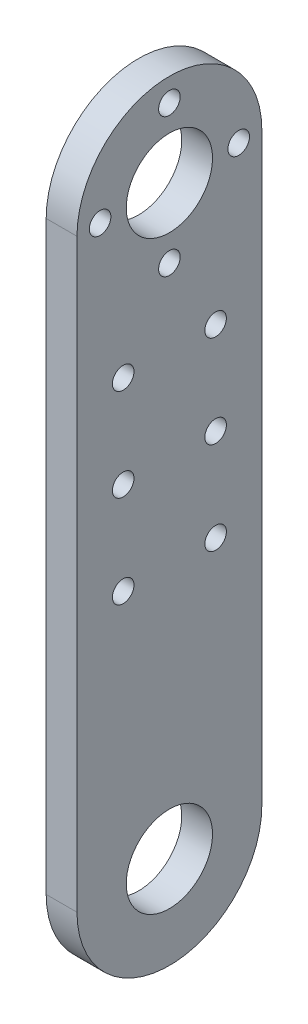
ISO-10303-21;
HEADER;
FILE_DESCRIPTION(('STEP AP214'),'2;1');
FILE_NAME('part.step','',(''),(''),'','','');
FILE_SCHEMA(('AUTOMOTIVE_DESIGN { 1 0 10303 214 1 1 1 1 }'));
ENDSEC;
DATA;
#1=APPLICATION_CONTEXT('core data for automotive mechanical design processes');
#2=APPLICATION_PROTOCOL_DEFINITION('international standard','automotive_design',2000,#1);
#3=PRODUCT_CONTEXT('',#1,'mechanical');
#4=PRODUCT('Part','Part','',(#3));
#5=PRODUCT_RELATED_PRODUCT_CATEGORY('part','',(#4));
#6=PRODUCT_DEFINITION_FORMATION('','',#4);
#7=PRODUCT_DEFINITION_CONTEXT('part definition',#1,'design');
#8=PRODUCT_DEFINITION('design','',#6,#7);
#9=PRODUCT_DEFINITION_SHAPE('','',#8);
#10=(LENGTH_UNIT() NAMED_UNIT(*) SI_UNIT(.MILLI.,.METRE.));
#11=(NAMED_UNIT(*) PLANE_ANGLE_UNIT() SI_UNIT($,.RADIAN.));
#12=(NAMED_UNIT(*) SI_UNIT($,.STERADIAN.) SOLID_ANGLE_UNIT());
#13=UNCERTAINTY_MEASURE_WITH_UNIT(LENGTH_MEASURE(1.E-05),#10,'distance_accuracy_value','');
#14=(GEOMETRIC_REPRESENTATION_CONTEXT(3) GLOBAL_UNCERTAINTY_ASSIGNED_CONTEXT((#13)) GLOBAL_UNIT_ASSIGNED_CONTEXT((#10,
#11,#12)) REPRESENTATION_CONTEXT('',''));
#15=CARTESIAN_POINT('',(0.,0.,0.));
#16=DIRECTION('',(0.,0.,1.));
#17=DIRECTION('',(1.,0.,0.));
#18=AXIS2_PLACEMENT_3D('',#15,#16,#17);
#19=CARTESIAN_POINT('',(-20.,500.,120.));
#20=DIRECTION('',(1.,0.,0.));
#21=DIRECTION('',(0.,1.,0.));
#22=AXIS2_PLACEMENT_3D('',#19,#20,#21);
#23=PLANE('',#22);
#24=CARTESIAN_POINT('',(-20.,485.,60.));
#25=DIRECTION('',(1.,0.,0.));
#26=DIRECTION('',(0.,1.,0.));
#27=AXIS2_PLACEMENT_3D('',#24,#25,#26);
#28=CIRCLE('',#27,7.00000000000001);
#29=CARTESIAN_POINT('',(-20.,492.,60.));
#30=VERTEX_POINT('',#29);
#31=EDGE_CURVE('E179',#30,#30,#28,.T.);
#32=ORIENTED_EDGE('',*,*,#31,.T.);
#33=EDGE_LOOP('',(#32));
#34=FACE_BOUND('',#33,.T.);
#35=CARTESIAN_POINT('',(-20.,440.,105.));
#36=DIRECTION('',(1.,0.,0.));
#37=DIRECTION('',(0.,1.,0.));
#38=AXIS2_PLACEMENT_3D('',#35,#36,#37);
#39=CIRCLE('',#38,7.00000000000001);
#40=CARTESIAN_POINT('',(-20.,447.,105.));
#41=VERTEX_POINT('',#40);
#42=EDGE_CURVE('E173',#41,#41,#39,.T.);
#43=ORIENTED_EDGE('',*,*,#42,.T.);
#44=EDGE_LOOP('',(#43));
#45=FACE_BOUND('',#44,.T.);
#46=CARTESIAN_POINT('',(-20.,395.,60.));
#47=DIRECTION('',(1.,0.,0.));
#48=DIRECTION('',(0.,1.,0.));
#49=AXIS2_PLACEMENT_3D('',#46,#47,#48);
#50=CIRCLE('',#49,7.00000000000001);
#51=CARTESIAN_POINT('',(-20.,402.,60.));
#52=VERTEX_POINT('',#51);
#53=EDGE_CURVE('E167',#52,#52,#50,.T.);
#54=ORIENTED_EDGE('',*,*,#53,.T.);
#55=EDGE_LOOP('',(#54));
#56=FACE_BOUND('',#55,.T.);
#57=CARTESIAN_POINT('',(-20.,440.,15.));
#58=DIRECTION('',(1.,0.,0.));
#59=DIRECTION('',(0.,1.,0.));
#60=AXIS2_PLACEMENT_3D('',#57,#58,#59);
#61=CIRCLE('',#60,7.00000000000001);
#62=CARTESIAN_POINT('',(-20.,447.,15.));
#63=VERTEX_POINT('',#62);
#64=EDGE_CURVE('E161',#63,#63,#61,.T.);
#65=ORIENTED_EDGE('',*,*,#64,.T.);
#66=EDGE_LOOP('',(#65));
#67=FACE_BOUND('',#66,.T.);
#68=CARTESIAN_POINT('',(-20.,225.486069721099,90.));
#69=DIRECTION('',(1.,0.,0.));
#70=DIRECTION('',(0.,1.,0.));
#71=AXIS2_PLACEMENT_3D('',#68,#69,#70);
#72=CIRCLE('',#71,6.99999999999999);
#73=CARTESIAN_POINT('',(-20.,232.486069721099,90.));
#74=VERTEX_POINT('',#73);
#75=EDGE_CURVE('E155',#74,#74,#72,.T.);
#76=ORIENTED_EDGE('',*,*,#75,.T.);
#77=EDGE_LOOP('',(#76));
#78=FACE_BOUND('',#77,.T.);
#79=CARTESIAN_POINT('',(-20.,285.486069721099,90.));
#80=DIRECTION('',(1.,0.,0.));
#81=DIRECTION('',(0.,1.,0.));
#82=AXIS2_PLACEMENT_3D('',#79,#80,#81);
#83=CIRCLE('',#82,7.00000000000001);
#84=CARTESIAN_POINT('',(-20.,292.486069721099,90.));
#85=VERTEX_POINT('',#84);
#86=EDGE_CURVE('E149',#85,#85,#83,.T.);
#87=ORIENTED_EDGE('',*,*,#86,.T.);
#88=EDGE_LOOP('',(#87));
#89=FACE_BOUND('',#88,.T.);
#90=CARTESIAN_POINT('',(-20.,285.486069721099,30.));
#91=DIRECTION('',(1.,0.,0.));
#92=DIRECTION('',(0.,1.,0.));
#93=AXIS2_PLACEMENT_3D('',#90,#91,#92);
#94=CIRCLE('',#93,7.00000000000001);
#95=CARTESIAN_POINT('',(-20.,292.486069721099,30.));
#96=VERTEX_POINT('',#95);
#97=EDGE_CURVE('E143',#96,#96,#94,.T.);
#98=ORIENTED_EDGE('',*,*,#97,.T.);
#99=EDGE_LOOP('',(#98));
#100=FACE_BOUND('',#99,.T.);
#101=CARTESIAN_POINT('',(-20.,225.486069721099,30.));
#102=DIRECTION('',(1.,0.,0.));
#103=DIRECTION('',(0.,1.,0.));
#104=AXIS2_PLACEMENT_3D('',#101,#102,#103);
#105=CIRCLE('',#104,6.99999999999999);
#106=CARTESIAN_POINT('',(-20.,232.486069721099,30.));
#107=VERTEX_POINT('',#106);
#108=EDGE_CURVE('E137',#107,#107,#105,.T.);
#109=ORIENTED_EDGE('',*,*,#108,.T.);
#110=EDGE_LOOP('',(#109));
#111=FACE_BOUND('',#110,.T.);
#112=CARTESIAN_POINT('',(-20.,345.486069721099,30.));
#113=DIRECTION('',(1.,0.,0.));
#114=DIRECTION('',(0.,1.,0.));
#115=AXIS2_PLACEMENT_3D('',#112,#113,#114);
#116=CIRCLE('',#115,7.00000000000001);
#117=CARTESIAN_POINT('',(-20.,352.486069721099,30.));
#118=VERTEX_POINT('',#117);
#119=EDGE_CURVE('E131',#118,#118,#116,.T.);
#120=ORIENTED_EDGE('',*,*,#119,.T.);
#121=EDGE_LOOP('',(#120));
#122=FACE_BOUND('',#121,.T.);
#123=CARTESIAN_POINT('',(-20.,345.486069721099,90.));
#124=DIRECTION('',(1.,0.,0.));
#125=DIRECTION('',(0.,1.,0.));
#126=AXIS2_PLACEMENT_3D('',#123,#124,#125);
#127=CIRCLE('',#126,7.00000000000001);
#128=CARTESIAN_POINT('',(-20.,352.486069721099,90.));
#129=VERTEX_POINT('',#128);
#130=EDGE_CURVE('E95',#129,#129,#127,.T.);
#131=ORIENTED_EDGE('',*,*,#130,.T.);
#132=EDGE_LOOP('',(#131));
#133=FACE_BOUND('',#132,.T.);
#134=CARTESIAN_POINT('',(-20.,440.,60.));
#135=DIRECTION('',(1.,0.,0.));
#136=DIRECTION('',(0.,1.,0.));
#137=AXIS2_PLACEMENT_3D('',#134,#135,#136);
#138=CIRCLE('',#137,28.);
#139=CARTESIAN_POINT('',(-20.,468.,60.));
#140=VERTEX_POINT('',#139);
#141=EDGE_CURVE('E110',#140,#140,#138,.T.);
#142=ORIENTED_EDGE('',*,*,#141,.T.);
#143=EDGE_LOOP('',(#142));
#144=FACE_BOUND('',#143,.T.);
#145=CARTESIAN_POINT('',(-20.,60.,60.));
#146=DIRECTION('',(1.,0.,0.));
#147=DIRECTION('',(0.,1.,0.));
#148=AXIS2_PLACEMENT_3D('',#145,#146,#147);
#149=CIRCLE('',#148,28.);
#150=CARTESIAN_POINT('',(-20.,88.,60.));
#151=VERTEX_POINT('',#150);
#152=EDGE_CURVE('E105',#151,#151,#149,.T.);
#153=ORIENTED_EDGE('',*,*,#152,.T.);
#154=EDGE_LOOP('',(#153));
#155=FACE_BOUND('',#154,.T.);
#156=DIRECTION('',(0.,-1.,0.));
#157=VECTOR('',#156,1.);
#158=CARTESIAN_POINT('',(-20.,500.,120.));
#159=LINE('',#158,#157);
#160=CARTESIAN_POINT('',(-20.,440.,120.));
#161=VERTEX_POINT('',#160);
#162=CARTESIAN_POINT('',(-20.,60.0000000000001,120.));
#163=VERTEX_POINT('',#162);
#164=EDGE_CURVE('E50',#161,#163,#159,.T.);
#165=ORIENTED_EDGE('',*,*,#164,.F.);
#166=CARTESIAN_POINT('',(-20.,440.,60.));
#167=DIRECTION('',(-1.,0.,0.));
#168=DIRECTION('',(0.,-1.,0.));
#169=AXIS2_PLACEMENT_3D('',#166,#167,#168);
#170=CIRCLE('',#169,60.);
#171=CARTESIAN_POINT('',(-20.,440.,0.));
#172=VERTEX_POINT('',#171);
#173=EDGE_CURVE('E80',#161,#172,#170,.T.);
#174=ORIENTED_EDGE('',*,*,#173,.T.);
#175=DIRECTION('',(0.,-1.,0.));
#176=VECTOR('',#175,1.);
#177=CARTESIAN_POINT('',(-20.,500.,0.));
#178=LINE('',#177,#176);
#179=CARTESIAN_POINT('',(-20.,60.0000000000001,0.));
#180=VERTEX_POINT('',#179);
#181=EDGE_CURVE('E101',#172,#180,#178,.T.);
#182=ORIENTED_EDGE('',*,*,#181,.T.);
#183=CARTESIAN_POINT('',(-20.,60.0000000000001,60.));
#184=DIRECTION('',(-1.,0.,0.));
#185=DIRECTION('',(0.,-1.,0.));
#186=AXIS2_PLACEMENT_3D('',#183,#184,#185);
#187=CIRCLE('',#186,60.);
#188=EDGE_CURVE('E98',#180,#163,#187,.T.);
#189=ORIENTED_EDGE('',*,*,#188,.T.);
#190=EDGE_LOOP('',(#165,#174,#182,#189));
#191=FACE_BOUND('',#190,.T.);
#192=ADVANCED_FACE('F42',(#34,#45,#56,#67,#78,#89,#100,#111,#122,#133,#144,#155,#191),#23,.F.);
#193=CARTESIAN_POINT('',(0.,500.,120.));
#194=DIRECTION('',(1.,0.,0.));
#195=DIRECTION('',(0.,1.,0.));
#196=AXIS2_PLACEMENT_3D('',#193,#194,#195);
#197=PLANE('',#196);
#198=CARTESIAN_POINT('',(0.,485.,60.));
#199=DIRECTION('',(1.,0.,0.));
#200=DIRECTION('',(0.,0.,-1.));
#201=AXIS2_PLACEMENT_3D('',#198,#199,#200);
#202=CIRCLE('',#201,7.00000000000001);
#203=CARTESIAN_POINT('',(0.,485.,53.));
#204=VERTEX_POINT('',#203);
#205=EDGE_CURVE('E182',#204,#204,#202,.T.);
#206=ORIENTED_EDGE('',*,*,#205,.F.);
#207=EDGE_LOOP('',(#206));
#208=FACE_BOUND('',#207,.T.);
#209=CARTESIAN_POINT('',(0.,440.,105.));
#210=DIRECTION('',(1.,0.,0.));
#211=DIRECTION('',(0.,0.,-1.));
#212=AXIS2_PLACEMENT_3D('',#209,#210,#211);
#213=CIRCLE('',#212,7.00000000000001);
#214=CARTESIAN_POINT('',(0.,440.,98.));
#215=VERTEX_POINT('',#214);
#216=EDGE_CURVE('E176',#215,#215,#213,.T.);
#217=ORIENTED_EDGE('',*,*,#216,.F.);
#218=EDGE_LOOP('',(#217));
#219=FACE_BOUND('',#218,.T.);
#220=CARTESIAN_POINT('',(0.,395.,60.));
#221=DIRECTION('',(1.,0.,0.));
#222=DIRECTION('',(0.,0.,-1.));
#223=AXIS2_PLACEMENT_3D('',#220,#221,#222);
#224=CIRCLE('',#223,7.00000000000001);
#225=CARTESIAN_POINT('',(0.,395.,53.));
#226=VERTEX_POINT('',#225);
#227=EDGE_CURVE('E170',#226,#226,#224,.T.);
#228=ORIENTED_EDGE('',*,*,#227,.F.);
#229=EDGE_LOOP('',(#228));
#230=FACE_BOUND('',#229,.T.);
#231=CARTESIAN_POINT('',(0.,440.,15.));
#232=DIRECTION('',(1.,0.,0.));
#233=DIRECTION('',(0.,0.,-1.));
#234=AXIS2_PLACEMENT_3D('',#231,#232,#233);
#235=CIRCLE('',#234,7.00000000000001);
#236=CARTESIAN_POINT('',(0.,440.,7.99999999999999));
#237=VERTEX_POINT('',#236);
#238=EDGE_CURVE('E164',#237,#237,#235,.T.);
#239=ORIENTED_EDGE('',*,*,#238,.F.);
#240=EDGE_LOOP('',(#239));
#241=FACE_BOUND('',#240,.T.);
#242=CARTESIAN_POINT('',(0.,225.486069721099,90.));
#243=DIRECTION('',(1.,0.,0.));
#244=DIRECTION('',(0.,0.,-1.));
#245=AXIS2_PLACEMENT_3D('',#242,#243,#244);
#246=CIRCLE('',#245,7.00000000000001);
#247=CARTESIAN_POINT('',(0.,225.486069721099,83.));
#248=VERTEX_POINT('',#247);
#249=EDGE_CURVE('E158',#248,#248,#246,.T.);
#250=ORIENTED_EDGE('',*,*,#249,.F.);
#251=EDGE_LOOP('',(#250));
#252=FACE_BOUND('',#251,.T.);
#253=CARTESIAN_POINT('',(0.,285.486069721099,90.));
#254=DIRECTION('',(1.,0.,0.));
#255=DIRECTION('',(0.,0.,-1.));
#256=AXIS2_PLACEMENT_3D('',#253,#254,#255);
#257=CIRCLE('',#256,7.00000000000001);
#258=CARTESIAN_POINT('',(0.,285.486069721099,83.));
#259=VERTEX_POINT('',#258);
#260=EDGE_CURVE('E152',#259,#259,#257,.T.);
#261=ORIENTED_EDGE('',*,*,#260,.F.);
#262=EDGE_LOOP('',(#261));
#263=FACE_BOUND('',#262,.T.);
#264=CARTESIAN_POINT('',(0.,285.486069721099,30.));
#265=DIRECTION('',(1.,0.,0.));
#266=DIRECTION('',(0.,0.,-1.));
#267=AXIS2_PLACEMENT_3D('',#264,#265,#266);
#268=CIRCLE('',#267,7.00000000000001);
#269=CARTESIAN_POINT('',(0.,285.486069721099,23.));
#270=VERTEX_POINT('',#269);
#271=EDGE_CURVE('E146',#270,#270,#268,.T.);
#272=ORIENTED_EDGE('',*,*,#271,.F.);
#273=EDGE_LOOP('',(#272));
#274=FACE_BOUND('',#273,.T.);
#275=CARTESIAN_POINT('',(0.,225.486069721099,30.));
#276=DIRECTION('',(1.,0.,0.));
#277=DIRECTION('',(0.,0.,-1.));
#278=AXIS2_PLACEMENT_3D('',#275,#276,#277);
#279=CIRCLE('',#278,7.00000000000001);
#280=CARTESIAN_POINT('',(0.,225.486069721099,23.));
#281=VERTEX_POINT('',#280);
#282=EDGE_CURVE('E140',#281,#281,#279,.T.);
#283=ORIENTED_EDGE('',*,*,#282,.F.);
#284=EDGE_LOOP('',(#283));
#285=FACE_BOUND('',#284,.T.);
#286=CARTESIAN_POINT('',(0.,345.486069721099,30.));
#287=DIRECTION('',(1.,0.,0.));
#288=DIRECTION('',(0.,0.,-1.));
#289=AXIS2_PLACEMENT_3D('',#286,#287,#288);
#290=CIRCLE('',#289,7.00000000000001);
#291=CARTESIAN_POINT('',(0.,345.486069721099,23.));
#292=VERTEX_POINT('',#291);
#293=EDGE_CURVE('E134',#292,#292,#290,.T.);
#294=ORIENTED_EDGE('',*,*,#293,.F.);
#295=EDGE_LOOP('',(#294));
#296=FACE_BOUND('',#295,.T.);
#297=CARTESIAN_POINT('',(0.,345.486069721099,90.));
#298=DIRECTION('',(1.,0.,0.));
#299=DIRECTION('',(0.,0.,-1.));
#300=AXIS2_PLACEMENT_3D('',#297,#298,#299);
#301=CIRCLE('',#300,7.00000000000001);
#302=CARTESIAN_POINT('',(0.,345.486069721099,83.));
#303=VERTEX_POINT('',#302);
#304=EDGE_CURVE('E128',#303,#303,#301,.T.);
#305=ORIENTED_EDGE('',*,*,#304,.F.);
#306=EDGE_LOOP('',(#305));
#307=FACE_BOUND('',#306,.T.);
#308=CARTESIAN_POINT('',(0.,440.,60.));
#309=DIRECTION('',(1.,0.,0.));
#310=DIRECTION('',(0.,1.,0.));
#311=AXIS2_PLACEMENT_3D('',#308,#309,#310);
#312=CIRCLE('',#311,28.);
#313=CARTESIAN_POINT('',(0.,468.,60.));
#314=VERTEX_POINT('',#313);
#315=EDGE_CURVE('E112',#314,#314,#312,.T.);
#316=ORIENTED_EDGE('',*,*,#315,.F.);
#317=EDGE_LOOP('',(#316));
#318=FACE_BOUND('',#317,.T.);
#319=CARTESIAN_POINT('',(0.,60.,60.));
#320=DIRECTION('',(1.,0.,0.));
#321=DIRECTION('',(0.,1.,0.));
#322=AXIS2_PLACEMENT_3D('',#319,#320,#321);
#323=CIRCLE('',#322,28.);
#324=CARTESIAN_POINT('',(0.,88.,60.));
#325=VERTEX_POINT('',#324);
#326=EDGE_CURVE('E103',#325,#325,#323,.T.);
#327=ORIENTED_EDGE('',*,*,#326,.F.);
#328=EDGE_LOOP('',(#327));
#329=FACE_BOUND('',#328,.T.);
#330=CARTESIAN_POINT('',(0.,440.,60.));
#331=DIRECTION('',(-1.,0.,0.));
#332=DIRECTION('',(0.,-1.,0.));
#333=AXIS2_PLACEMENT_3D('',#330,#331,#332);
#334=CIRCLE('',#333,60.);
#335=CARTESIAN_POINT('',(0.,440.,120.));
#336=VERTEX_POINT('',#335);
#337=CARTESIAN_POINT('',(0.,440.,0.));
#338=VERTEX_POINT('',#337);
#339=EDGE_CURVE('E58',#336,#338,#334,.T.);
#340=ORIENTED_EDGE('',*,*,#339,.F.);
#341=DIRECTION('',(0.,-1.,0.));
#342=VECTOR('',#341,1.);
#343=CARTESIAN_POINT('',(0.,500.,120.));
#344=LINE('',#343,#342);
#345=CARTESIAN_POINT('',(0.,60.0000000000001,120.));
#346=VERTEX_POINT('',#345);
#347=EDGE_CURVE('E11',#336,#346,#344,.T.);
#348=ORIENTED_EDGE('',*,*,#347,.T.);
#349=CARTESIAN_POINT('',(0.,60.0000000000001,60.));
#350=DIRECTION('',(-1.,0.,0.));
#351=DIRECTION('',(0.,-1.,0.));
#352=AXIS2_PLACEMENT_3D('',#349,#350,#351);
#353=CIRCLE('',#352,60.);
#354=CARTESIAN_POINT('',(0.,60.0000000000001,0.));
#355=VERTEX_POINT('',#354);
#356=EDGE_CURVE('E119',#355,#346,#353,.T.);
#357=ORIENTED_EDGE('',*,*,#356,.F.);
#358=DIRECTION('',(0.,-1.,0.));
#359=VECTOR('',#358,1.);
#360=CARTESIAN_POINT('',(0.,500.,0.));
#361=LINE('',#360,#359);
#362=EDGE_CURVE('E45',#338,#355,#361,.T.);
#363=ORIENTED_EDGE('',*,*,#362,.F.);
#364=EDGE_LOOP('',(#340,#348,#357,#363));
#365=FACE_BOUND('',#364,.T.);
#366=ADVANCED_FACE('F189',(#208,#219,#230,#241,#252,#263,#274,#285,#296,#307,#318,#329,#365),
#197,.T.);
#367=CARTESIAN_POINT('',(0.,0.,0.));
#368=DIRECTION('',(0.,0.,-1.));
#369=DIRECTION('',(-1.,0.,0.));
#370=AXIS2_PLACEMENT_3D('',#367,#368,#369);
#371=PLANE('',#370);
#372=ORIENTED_EDGE('',*,*,#362,.T.);
#373=DIRECTION('',(-1.,0.,0.));
#374=VECTOR('',#373,1.);
#375=CARTESIAN_POINT('',(-20.,60.0000000000001,0.));
#376=LINE('',#375,#374);
#377=EDGE_CURVE('E89',#180,#355,#376,.F.);
#378=ORIENTED_EDGE('',*,*,#377,.F.);
#379=ORIENTED_EDGE('',*,*,#181,.F.);
#380=DIRECTION('',(-1.,0.,0.));
#381=VECTOR('',#380,1.);
#382=CARTESIAN_POINT('',(-20.,440.,0.));
#383=LINE('',#382,#381);
#384=EDGE_CURVE('E84',#172,#338,#383,.F.);
#385=ORIENTED_EDGE('',*,*,#384,.T.);
#386=EDGE_LOOP('',(#372,#378,#379,#385));
#387=FACE_BOUND('',#386,.T.);
#388=ADVANCED_FACE('F192',(#387),#371,.T.);
#389=CARTESIAN_POINT('',(0.,0.,120.));
#390=DIRECTION('',(0.,0.,-1.));
#391=DIRECTION('',(-1.,0.,0.));
#392=AXIS2_PLACEMENT_3D('',#389,#390,#391);
#393=PLANE('',#392);
#394=ORIENTED_EDGE('',*,*,#347,.F.);
#395=DIRECTION('',(-1.,0.,0.));
#396=VECTOR('',#395,1.);
#397=CARTESIAN_POINT('',(-20.,440.,120.));
#398=LINE('',#397,#396);
#399=EDGE_CURVE('E83',#161,#336,#398,.F.);
#400=ORIENTED_EDGE('',*,*,#399,.F.);
#401=ORIENTED_EDGE('',*,*,#164,.T.);
#402=DIRECTION('',(-1.,0.,0.));
#403=VECTOR('',#402,1.);
#404=CARTESIAN_POINT('',(-20.,60.0000000000001,120.));
#405=LINE('',#404,#403);
#406=EDGE_CURVE('E115',#163,#346,#405,.F.);
#407=ORIENTED_EDGE('',*,*,#406,.T.);
#408=EDGE_LOOP('',(#394,#400,#401,#407));
#409=FACE_BOUND('',#408,.T.);
#410=ADVANCED_FACE('F92',(#409),#393,.F.);
#411=CARTESIAN_POINT('',(-20.,60.,60.));
#412=DIRECTION('',(1.,0.,0.));
#413=DIRECTION('',(0.,1.,0.));
#414=AXIS2_PLACEMENT_3D('',#411,#412,#413);
#415=CYLINDRICAL_SURFACE('',#414,28.);
#416=ORIENTED_EDGE('',*,*,#152,.F.);
#417=EDGE_LOOP('',(#416));
#418=FACE_BOUND('',#417,.T.);
#419=ORIENTED_EDGE('',*,*,#326,.T.);
#420=EDGE_LOOP('',(#419));
#421=FACE_BOUND('',#420,.T.);
#422=ADVANCED_FACE('F228',(#418,#421),#415,.F.);
#423=CARTESIAN_POINT('',(-20.,440.,60.));
#424=DIRECTION('',(1.,0.,0.));
#425=DIRECTION('',(0.,1.,0.));
#426=AXIS2_PLACEMENT_3D('',#423,#424,#425);
#427=CYLINDRICAL_SURFACE('',#426,28.);
#428=ORIENTED_EDGE('',*,*,#141,.F.);
#429=EDGE_LOOP('',(#428));
#430=FACE_BOUND('',#429,.T.);
#431=ORIENTED_EDGE('',*,*,#315,.T.);
#432=EDGE_LOOP('',(#431));
#433=FACE_BOUND('',#432,.T.);
#434=ADVANCED_FACE('F220',(#430,#433),#427,.F.);
#435=CARTESIAN_POINT('',(-20.,60.0000000000001,60.));
#436=DIRECTION('',(-1.,0.,0.));
#437=DIRECTION('',(0.,-1.,0.));
#438=AXIS2_PLACEMENT_3D('',#435,#436,#437);
#439=CYLINDRICAL_SURFACE('',#438,60.);
#440=ORIENTED_EDGE('',*,*,#188,.F.);
#441=ORIENTED_EDGE('',*,*,#377,.T.);
#442=ORIENTED_EDGE('',*,*,#356,.T.);
#443=ORIENTED_EDGE('',*,*,#406,.F.);
#444=EDGE_LOOP('',(#440,#441,#442,#443));
#445=FACE_BOUND('',#444,.T.);
#446=ADVANCED_FACE('F218',(#445),#439,.T.);
#447=CARTESIAN_POINT('',(-20.,440.,60.));
#448=DIRECTION('',(-1.,0.,0.));
#449=DIRECTION('',(0.,-1.,0.));
#450=AXIS2_PLACEMENT_3D('',#447,#448,#449);
#451=CYLINDRICAL_SURFACE('',#450,60.);
#452=ORIENTED_EDGE('',*,*,#173,.F.);
#453=ORIENTED_EDGE('',*,*,#399,.T.);
#454=ORIENTED_EDGE('',*,*,#339,.T.);
#455=ORIENTED_EDGE('',*,*,#384,.F.);
#456=EDGE_LOOP('',(#452,#453,#454,#455));
#457=FACE_BOUND('',#456,.T.);
#458=ADVANCED_FACE('F82',(#457),#451,.T.);
#459=CARTESIAN_POINT('',(0.,345.486069721099,90.));
#460=DIRECTION('',(1.,0.,0.));
#461=DIRECTION('',(0.,0.,-1.));
#462=AXIS2_PLACEMENT_3D('',#459,#460,#461);
#463=CYLINDRICAL_SURFACE('',#462,7.00000000000001);
#464=ORIENTED_EDGE('',*,*,#304,.T.);
#465=EDGE_LOOP('',(#464));
#466=FACE_BOUND('',#465,.T.);
#467=ORIENTED_EDGE('',*,*,#130,.F.);
#468=EDGE_LOOP('',(#467));
#469=FACE_BOUND('',#468,.T.);
#470=ADVANCED_FACE('F226',(#466,#469),#463,.F.);
#471=CARTESIAN_POINT('',(0.,345.486069721099,30.));
#472=DIRECTION('',(1.,0.,0.));
#473=DIRECTION('',(0.,0.,-1.));
#474=AXIS2_PLACEMENT_3D('',#471,#472,#473);
#475=CYLINDRICAL_SURFACE('',#474,7.00000000000001);
#476=ORIENTED_EDGE('',*,*,#293,.T.);
#477=EDGE_LOOP('',(#476));
#478=FACE_BOUND('',#477,.T.);
#479=ORIENTED_EDGE('',*,*,#119,.F.);
#480=EDGE_LOOP('',(#479));
#481=FACE_BOUND('',#480,.T.);
#482=ADVANCED_FACE('F259',(#478,#481),#475,.F.);
#483=CARTESIAN_POINT('',(0.,225.486069721099,30.));
#484=DIRECTION('',(1.,0.,0.));
#485=DIRECTION('',(0.,0.,-1.));
#486=AXIS2_PLACEMENT_3D('',#483,#484,#485);
#487=CYLINDRICAL_SURFACE('',#486,6.99999999999999);
#488=ORIENTED_EDGE('',*,*,#282,.T.);
#489=EDGE_LOOP('',(#488));
#490=FACE_BOUND('',#489,.T.);
#491=ORIENTED_EDGE('',*,*,#108,.F.);
#492=EDGE_LOOP('',(#491));
#493=FACE_BOUND('',#492,.T.);
#494=ADVANCED_FACE('F265',(#490,#493),#487,.F.);
#495=CARTESIAN_POINT('',(0.,285.486069721099,30.));
#496=DIRECTION('',(1.,0.,0.));
#497=DIRECTION('',(0.,0.,-1.));
#498=AXIS2_PLACEMENT_3D('',#495,#496,#497);
#499=CYLINDRICAL_SURFACE('',#498,7.00000000000001);
#500=ORIENTED_EDGE('',*,*,#271,.T.);
#501=EDGE_LOOP('',(#500));
#502=FACE_BOUND('',#501,.T.);
#503=ORIENTED_EDGE('',*,*,#97,.F.);
#504=EDGE_LOOP('',(#503));
#505=FACE_BOUND('',#504,.T.);
#506=ADVANCED_FACE('F271',(#502,#505),#499,.F.);
#507=CARTESIAN_POINT('',(0.,285.486069721099,90.));
#508=DIRECTION('',(1.,0.,0.));
#509=DIRECTION('',(0.,0.,-1.));
#510=AXIS2_PLACEMENT_3D('',#507,#508,#509);
#511=CYLINDRICAL_SURFACE('',#510,7.00000000000001);
#512=ORIENTED_EDGE('',*,*,#260,.T.);
#513=EDGE_LOOP('',(#512));
#514=FACE_BOUND('',#513,.T.);
#515=ORIENTED_EDGE('',*,*,#86,.F.);
#516=EDGE_LOOP('',(#515));
#517=FACE_BOUND('',#516,.T.);
#518=ADVANCED_FACE('F275',(#514,#517),#511,.F.);
#519=CARTESIAN_POINT('',(0.,225.486069721099,90.));
#520=DIRECTION('',(1.,0.,0.));
#521=DIRECTION('',(0.,0.,-1.));
#522=AXIS2_PLACEMENT_3D('',#519,#520,#521);
#523=CYLINDRICAL_SURFACE('',#522,6.99999999999999);
#524=ORIENTED_EDGE('',*,*,#249,.T.);
#525=EDGE_LOOP('',(#524));
#526=FACE_BOUND('',#525,.T.);
#527=ORIENTED_EDGE('',*,*,#75,.F.);
#528=EDGE_LOOP('',(#527));
#529=FACE_BOUND('',#528,.T.);
#530=ADVANCED_FACE('F279',(#526,#529),#523,.F.);
#531=CARTESIAN_POINT('',(0.,440.,15.));
#532=DIRECTION('',(1.,0.,0.));
#533=DIRECTION('',(0.,0.,-1.));
#534=AXIS2_PLACEMENT_3D('',#531,#532,#533);
#535=CYLINDRICAL_SURFACE('',#534,7.00000000000001);
#536=ORIENTED_EDGE('',*,*,#238,.T.);
#537=EDGE_LOOP('',(#536));
#538=FACE_BOUND('',#537,.T.);
#539=ORIENTED_EDGE('',*,*,#64,.F.);
#540=EDGE_LOOP('',(#539));
#541=FACE_BOUND('',#540,.T.);
#542=ADVANCED_FACE('F283',(#538,#541),#535,.F.);
#543=CARTESIAN_POINT('',(0.,395.,60.));
#544=DIRECTION('',(1.,0.,0.));
#545=DIRECTION('',(0.,0.,-1.));
#546=AXIS2_PLACEMENT_3D('',#543,#544,#545);
#547=CYLINDRICAL_SURFACE('',#546,7.00000000000001);
#548=ORIENTED_EDGE('',*,*,#227,.T.);
#549=EDGE_LOOP('',(#548));
#550=FACE_BOUND('',#549,.T.);
#551=ORIENTED_EDGE('',*,*,#53,.F.);
#552=EDGE_LOOP('',(#551));
#553=FACE_BOUND('',#552,.T.);
#554=ADVANCED_FACE('F287',(#550,#553),#547,.F.);
#555=CARTESIAN_POINT('',(0.,440.,105.));
#556=DIRECTION('',(1.,0.,0.));
#557=DIRECTION('',(0.,0.,-1.));
#558=AXIS2_PLACEMENT_3D('',#555,#556,#557);
#559=CYLINDRICAL_SURFACE('',#558,7.00000000000001);
#560=ORIENTED_EDGE('',*,*,#216,.T.);
#561=EDGE_LOOP('',(#560));
#562=FACE_BOUND('',#561,.T.);
#563=ORIENTED_EDGE('',*,*,#42,.F.);
#564=EDGE_LOOP('',(#563));
#565=FACE_BOUND('',#564,.T.);
#566=ADVANCED_FACE('F291',(#562,#565),#559,.F.);
#567=CARTESIAN_POINT('',(0.,485.,60.));
#568=DIRECTION('',(1.,0.,0.));
#569=DIRECTION('',(0.,0.,-1.));
#570=AXIS2_PLACEMENT_3D('',#567,#568,#569);
#571=CYLINDRICAL_SURFACE('',#570,7.00000000000001);
#572=ORIENTED_EDGE('',*,*,#205,.T.);
#573=EDGE_LOOP('',(#572));
#574=FACE_BOUND('',#573,.T.);
#575=ORIENTED_EDGE('',*,*,#31,.F.);
#576=EDGE_LOOP('',(#575));
#577=FACE_BOUND('',#576,.T.);
#578=ADVANCED_FACE('F186',(#574,#577),#571,.F.);
#579=CLOSED_SHELL('',(#192,#366,#388,#410,#422,#434,#446,#458,#470,#482,#494,#506,#518,#530,
#542,#554,#566,#578));
#580=MANIFOLD_SOLID_BREP('B2',#579);
#581=ADVANCED_BREP_SHAPE_REPRESENTATION('',(#18,#580),#14);
#582=SHAPE_DEFINITION_REPRESENTATION(#9,#581);
ENDSEC;
END-ISO-10303-21;
